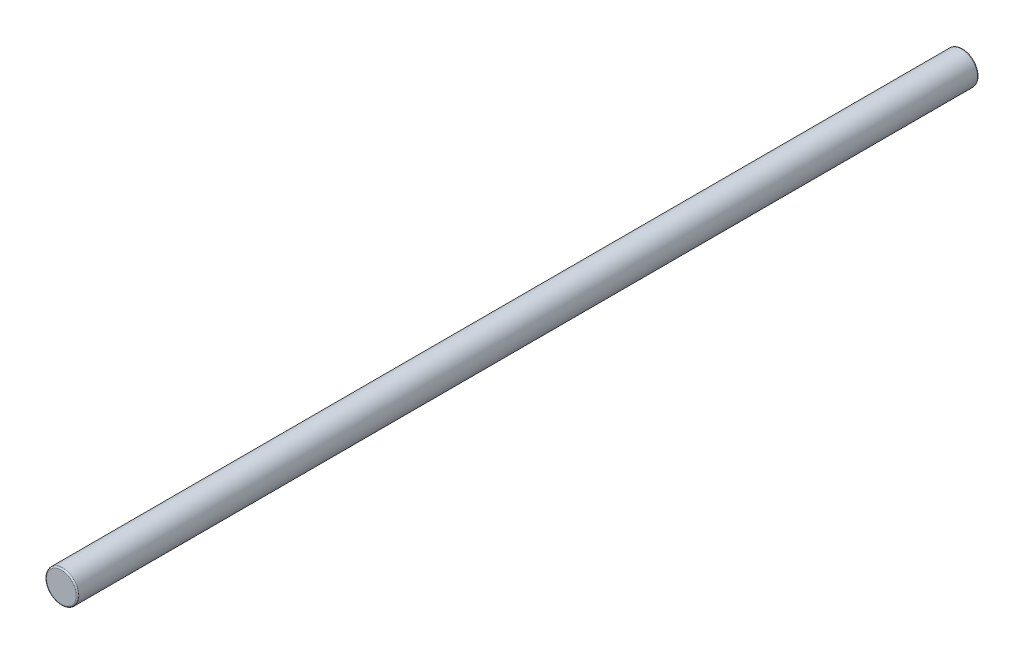
ISO-10303-21;
HEADER;
FILE_DESCRIPTION(('STEP AP214'),'2;1');
FILE_NAME('part.step','',(''),(''),'','','');
FILE_SCHEMA(('AUTOMOTIVE_DESIGN { 1 0 10303 214 1 1 1 1 }'));
ENDSEC;
DATA;
#1=APPLICATION_CONTEXT('core data for automotive mechanical design processes');
#2=APPLICATION_PROTOCOL_DEFINITION('international standard','automotive_design',2000,#1);
#3=PRODUCT_CONTEXT('',#1,'mechanical');
#4=PRODUCT('Part','Part','',(#3));
#5=PRODUCT_RELATED_PRODUCT_CATEGORY('part','',(#4));
#6=PRODUCT_DEFINITION_FORMATION('','',#4);
#7=PRODUCT_DEFINITION_CONTEXT('part definition',#1,'design');
#8=PRODUCT_DEFINITION('design','',#6,#7);
#9=PRODUCT_DEFINITION_SHAPE('','',#8);
#10=(LENGTH_UNIT() NAMED_UNIT(*) SI_UNIT(.MILLI.,.METRE.));
#11=(NAMED_UNIT(*) PLANE_ANGLE_UNIT() SI_UNIT($,.RADIAN.));
#12=(NAMED_UNIT(*) SI_UNIT($,.STERADIAN.) SOLID_ANGLE_UNIT());
#13=UNCERTAINTY_MEASURE_WITH_UNIT(LENGTH_MEASURE(1.E-05),#10,'distance_accuracy_value','');
#14=(GEOMETRIC_REPRESENTATION_CONTEXT(3) GLOBAL_UNCERTAINTY_ASSIGNED_CONTEXT((#13)) GLOBAL_UNIT_ASSIGNED_CONTEXT((#10,
#11,#12)) REPRESENTATION_CONTEXT('',''));
#15=CARTESIAN_POINT('',(0.,0.,0.));
#16=DIRECTION('',(0.,0.,1.));
#17=DIRECTION('',(1.,0.,0.));
#18=AXIS2_PLACEMENT_3D('',#15,#16,#17);
#19=CARTESIAN_POINT('',(0.,0.,335.));
#20=DIRECTION('',(0.,0.,-1.));
#21=DIRECTION('',(-1.,0.,0.));
#22=AXIS2_PLACEMENT_3D('',#19,#20,#21);
#23=CYLINDRICAL_SURFACE('',#22,6.);
#24=CARTESIAN_POINT('',(0.,0.,0.5));
#25=DIRECTION('',(0.,0.,1.));
#26=DIRECTION('',(1.,0.,0.));
#27=AXIS2_PLACEMENT_3D('',#24,#25,#26);
#28=CIRCLE('',#27,6.);
#29=CARTESIAN_POINT('',(6.,0.,0.5));
#30=VERTEX_POINT('',#29);
#31=EDGE_CURVE('E50',#30,#30,#28,.T.);
#32=ORIENTED_EDGE('',*,*,#31,.T.);
#33=EDGE_LOOP('',(#32));
#34=FACE_BOUND('',#33,.T.);
#35=CARTESIAN_POINT('',(0.,0.,334.5));
#36=DIRECTION('',(0.,0.,1.));
#37=DIRECTION('',(1.,0.,0.));
#38=AXIS2_PLACEMENT_3D('',#35,#36,#37);
#39=CIRCLE('',#38,6.);
#40=CARTESIAN_POINT('',(6.,0.,334.5));
#41=VERTEX_POINT('',#40);
#42=EDGE_CURVE('E55',#41,#41,#39,.F.);
#43=ORIENTED_EDGE('',*,*,#42,.T.);
#44=EDGE_LOOP('',(#43));
#45=FACE_BOUND('',#44,.T.);
#46=ADVANCED_FACE('F37',(#34,#45),#23,.T.);
#47=CARTESIAN_POINT('',(0.,0.,335.));
#48=DIRECTION('',(0.,0.,1.));
#49=DIRECTION('',(1.,0.,0.));
#50=AXIS2_PLACEMENT_3D('',#47,#48,#49);
#51=PLANE('',#50);
#52=CARTESIAN_POINT('',(0.,0.,335.));
#53=DIRECTION('',(0.,0.,1.));
#54=DIRECTION('',(1.,0.,0.));
#55=AXIS2_PLACEMENT_3D('',#52,#53,#54);
#56=CIRCLE('',#55,5.5);
#57=CARTESIAN_POINT('',(5.5,0.,335.));
#58=VERTEX_POINT('',#57);
#59=EDGE_CURVE('E10',#58,#58,#56,.T.);
#60=ORIENTED_EDGE('',*,*,#59,.T.);
#61=EDGE_LOOP('',(#60));
#62=FACE_BOUND('',#61,.T.);
#63=ADVANCED_FACE('F72',(#62),#51,.T.);
#64=CARTESIAN_POINT('',(0.,0.,0.));
#65=DIRECTION('',(0.,0.,1.));
#66=DIRECTION('',(1.,0.,0.));
#67=AXIS2_PLACEMENT_3D('',#64,#65,#66);
#68=PLANE('',#67);
#69=CARTESIAN_POINT('',(0.,0.,0.));
#70=DIRECTION('',(0.,0.,1.));
#71=DIRECTION('',(1.,0.,0.));
#72=AXIS2_PLACEMENT_3D('',#69,#70,#71);
#73=CIRCLE('',#72,5.5);
#74=CARTESIAN_POINT('',(5.5,0.,0.));
#75=VERTEX_POINT('',#74);
#76=EDGE_CURVE('E45',#75,#75,#73,.F.);
#77=ORIENTED_EDGE('',*,*,#76,.T.);
#78=EDGE_LOOP('',(#77));
#79=FACE_BOUND('',#78,.T.);
#80=ADVANCED_FACE('F69',(#79),#68,.F.);
#81=CARTESIAN_POINT('',(0.,0.,0.5));
#82=DIRECTION('',(0.,0.,1.));
#83=DIRECTION('',(1.,0.,0.));
#84=AXIS2_PLACEMENT_3D('',#81,#82,#83);
#85=TOROIDAL_SURFACE('',#84,5.5,0.5);
#86=ORIENTED_EDGE('',*,*,#76,.F.);
#87=EDGE_LOOP('',(#86));
#88=FACE_BOUND('',#87,.T.);
#89=ORIENTED_EDGE('',*,*,#31,.F.);
#90=EDGE_LOOP('',(#89));
#91=FACE_BOUND('',#90,.T.);
#92=ADVANCED_FACE('F65',(#88,#91),#85,.T.);
#93=CARTESIAN_POINT('',(0.,0.,334.5));
#94=DIRECTION('',(0.,0.,1.));
#95=DIRECTION('',(1.,0.,0.));
#96=AXIS2_PLACEMENT_3D('',#93,#94,#95);
#97=TOROIDAL_SURFACE('',#96,5.5,0.5);
#98=ORIENTED_EDGE('',*,*,#42,.F.);
#99=EDGE_LOOP('',(#98));
#100=FACE_BOUND('',#99,.T.);
#101=ORIENTED_EDGE('',*,*,#59,.F.);
#102=EDGE_LOOP('',(#101));
#103=FACE_BOUND('',#102,.T.);
#104=ADVANCED_FACE('F39',(#100,#103),#97,.T.);
#105=CLOSED_SHELL('',(#46,#63,#80,#92,#104));
#106=MANIFOLD_SOLID_BREP('B2',#105);
#107=ADVANCED_BREP_SHAPE_REPRESENTATION('',(#18,#106),#14);
#108=SHAPE_DEFINITION_REPRESENTATION(#9,#107);
ENDSEC;
END-ISO-10303-21;
